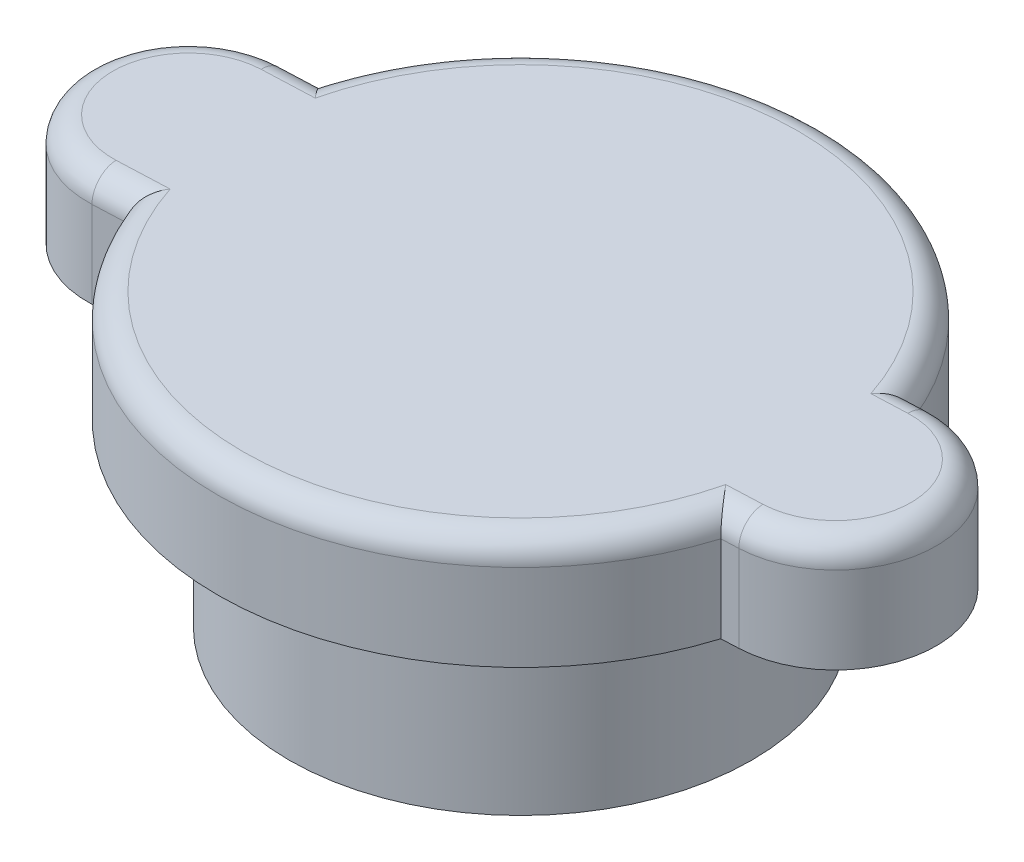
ISO-10303-21;
HEADER;
FILE_DESCRIPTION(('STEP AP214'),'2;1');
FILE_NAME('part.step','',(''),(''),'','','');
FILE_SCHEMA(('AUTOMOTIVE_DESIGN { 1 0 10303 214 1 1 1 1 }'));
ENDSEC;
DATA;
#1=APPLICATION_CONTEXT('core data for automotive mechanical design processes');
#2=APPLICATION_PROTOCOL_DEFINITION('international standard','automotive_design',2000,#1);
#3=PRODUCT_CONTEXT('',#1,'mechanical');
#4=PRODUCT('Part','Part','',(#3));
#5=PRODUCT_RELATED_PRODUCT_CATEGORY('part','',(#4));
#6=PRODUCT_DEFINITION_FORMATION('','',#4);
#7=PRODUCT_DEFINITION_CONTEXT('part definition',#1,'design');
#8=PRODUCT_DEFINITION('design','',#6,#7);
#9=PRODUCT_DEFINITION_SHAPE('','',#8);
#10=(LENGTH_UNIT() NAMED_UNIT(*) SI_UNIT(.MILLI.,.METRE.));
#11=(NAMED_UNIT(*) PLANE_ANGLE_UNIT() SI_UNIT($,.RADIAN.));
#12=(NAMED_UNIT(*) SI_UNIT($,.STERADIAN.) SOLID_ANGLE_UNIT());
#13=UNCERTAINTY_MEASURE_WITH_UNIT(LENGTH_MEASURE(1.E-05),#10,'distance_accuracy_value','');
#14=(GEOMETRIC_REPRESENTATION_CONTEXT(3) GLOBAL_UNCERTAINTY_ASSIGNED_CONTEXT((#13)) GLOBAL_UNIT_ASSIGNED_CONTEXT((#10,
#11,#12)) REPRESENTATION_CONTEXT('',''));
#15=CARTESIAN_POINT('',(0.,0.,0.));
#16=DIRECTION('',(0.,0.,1.));
#17=DIRECTION('',(1.,0.,0.));
#18=AXIS2_PLACEMENT_3D('',#15,#16,#17);
#19=CARTESIAN_POINT('',(0.,14.224,0.));
#20=DIRECTION('',(0.,-1.,0.));
#21=DIRECTION('',(0.,0.,-1.));
#22=AXIS2_PLACEMENT_3D('',#19,#20,#21);
#23=CYLINDRICAL_SURFACE('',#22,18.415);
#24=CARTESIAN_POINT('',(0.,14.224,0.));
#25=DIRECTION('',(0.,1.,0.));
#26=DIRECTION('',(0.,0.,1.));
#27=AXIS2_PLACEMENT_3D('',#24,#25,#26);
#28=CIRCLE('',#27,18.415);
#29=CARTESIAN_POINT('',(0.,14.224,18.415));
#30=VERTEX_POINT('',#29);
#31=EDGE_CURVE('E199',#30,#30,#28,.T.);
#32=ORIENTED_EDGE('',*,*,#31,.F.);
#33=EDGE_LOOP('',(#32));
#34=FACE_BOUND('',#33,.T.);
#35=CARTESIAN_POINT('',(0.,0.,0.));
#36=DIRECTION('',(0.,1.,0.));
#37=DIRECTION('',(0.,0.,1.));
#38=AXIS2_PLACEMENT_3D('',#35,#36,#37);
#39=CIRCLE('',#38,18.415);
#40=CARTESIAN_POINT('',(0.,0.,18.415));
#41=VERTEX_POINT('',#40);
#42=EDGE_CURVE('E157',#41,#41,#39,.T.);
#43=ORIENTED_EDGE('',*,*,#42,.T.);
#44=EDGE_LOOP('',(#43));
#45=FACE_BOUND('',#44,.T.);
#46=ADVANCED_FACE('F56',(#34,#45),#23,.T.);
#47=CARTESIAN_POINT('',(0.,0.,0.));
#48=DIRECTION('',(0.,1.,0.));
#49=DIRECTION('',(0.,0.,1.));
#50=AXIS2_PLACEMENT_3D('',#47,#48,#49);
#51=PLANE('',#50);
#52=ORIENTED_EDGE('',*,*,#42,.F.);
#53=EDGE_LOOP('',(#52));
#54=FACE_BOUND('',#53,.T.);
#55=ADVANCED_FACE('F347',(#54),#51,.F.);
#56=CARTESIAN_POINT('',(0.,23.114,0.));
#57=DIRECTION('',(0.,-1.,0.));
#58=DIRECTION('',(0.,0.,-1.));
#59=AXIS2_PLACEMENT_3D('',#56,#57,#58);
#60=CYLINDRICAL_SURFACE('',#59,24.0985030733377);
#61=DIRECTION('',(0.,-1.,0.));
#62=VECTOR('',#61,1.);
#63=CARTESIAN_POINT('',(-23.0324921981435,23.114,-7.08816996961317));
#64=LINE('',#63,#62);
#65=CARTESIAN_POINT('',(-23.0324921981435,14.224,-7.08816996961317));
#66=VERTEX_POINT('',#65);
#67=CARTESIAN_POINT('',(-23.0324921981435,21.114,-7.08816996961317));
#68=VERTEX_POINT('',#67);
#69=EDGE_CURVE('E179',#66,#68,#64,.F.);
#70=ORIENTED_EDGE('',*,*,#69,.T.);
#71=CARTESIAN_POINT('',(0.,21.114,0.));
#72=DIRECTION('',(0.,1.,0.));
#73=DIRECTION('',(0.,0.,1.));
#74=AXIS2_PLACEMENT_3D('',#71,#72,#73);
#75=CIRCLE('',#74,24.0985030733377);
#76=CARTESIAN_POINT('',(22.3744741533916,21.114,-8.95101987121461));
#77=VERTEX_POINT('',#76);
#78=EDGE_CURVE('E12',#68,#77,#75,.F.);
#79=ORIENTED_EDGE('',*,*,#78,.T.);
#80=DIRECTION('',(0.,-1.,0.));
#81=VECTOR('',#80,1.);
#82=CARTESIAN_POINT('',(22.3744741533916,23.114,-8.95101987121461));
#83=LINE('',#82,#81);
#84=CARTESIAN_POINT('',(22.3744741533916,14.224,-8.95101987121461));
#85=VERTEX_POINT('',#84);
#86=EDGE_CURVE('E196',#77,#85,#83,.T.);
#87=ORIENTED_EDGE('',*,*,#86,.T.);
#88=CARTESIAN_POINT('',(0.,14.224,0.));
#89=DIRECTION('',(0.,1.,0.));
#90=DIRECTION('',(0.,0.,1.));
#91=AXIS2_PLACEMENT_3D('',#88,#89,#90);
#92=CIRCLE('',#91,24.0985030733377);
#93=EDGE_CURVE('E175',#85,#66,#92,.T.);
#94=ORIENTED_EDGE('',*,*,#93,.T.);
#95=EDGE_LOOP('',(#70,#79,#87,#94));
#96=FACE_BOUND('',#95,.T.);
#97=ADVANCED_FACE('F324',(#96),#60,.T.);
#98=CARTESIAN_POINT('',(0.,14.224,0.));
#99=DIRECTION('',(0.,1.,0.));
#100=DIRECTION('',(0.,0.,1.));
#101=AXIS2_PLACEMENT_3D('',#98,#99,#100);
#102=PLANE('',#101);
#103=ORIENTED_EDGE('',*,*,#31,.T.);
#104=EDGE_LOOP('',(#103));
#105=FACE_BOUND('',#104,.T.);
#106=ORIENTED_EDGE('',*,*,#93,.F.);
#107=DIRECTION('',(0.999159509215093,0.,-0.0409911593524141));
#108=VECTOR('',#107,1.);
#109=CARTESIAN_POINT('',(-25.7076605564393,14.224,-6.97841947286257));
#110=LINE('',#109,#108);
#111=CARTESIAN_POINT('',(23.7492394811986,14.224,-9.00742050004771));
#112=VERTEX_POINT('',#111);
#113=EDGE_CURVE('E186',#85,#112,#110,.T.);
#114=ORIENTED_EDGE('',*,*,#113,.T.);
#115=CARTESIAN_POINT('',(24.0782485035745,14.224,-0.987825579633825));
#116=DIRECTION('',(0.,1.,0.));
#117=DIRECTION('',(0.,0.,1.));
#118=AXIS2_PLACEMENT_3D('',#115,#116,#117);
#119=CIRCLE('',#118,8.02634098604919);
#120=CARTESIAN_POINT('',(24.4072575259505,14.224,7.03176934078006));
#121=VERTEX_POINT('',#120);
#122=EDGE_CURVE('E168',#121,#112,#119,.T.);
#123=ORIENTED_EDGE('',*,*,#122,.F.);
#124=DIRECTION('',(0.999159509215093,0.,-0.0409911593524139));
#125=VECTOR('',#124,1.);
#126=CARTESIAN_POINT('',(-25.0496425116874,14.224,9.0607703679652));
#127=LINE('',#126,#125);
#128=CARTESIAN_POINT('',(23.0324921981435,14.224,7.08816996961317));
#129=VERTEX_POINT('',#128);
#130=EDGE_CURVE('E150',#129,#121,#127,.T.);
#131=ORIENTED_EDGE('',*,*,#130,.F.);
#132=CARTESIAN_POINT('',(-22.3744741533916,14.224,8.95101987121461));
#133=VERTEX_POINT('',#132);
#134=EDGE_CURVE('E165',#133,#129,#92,.T.);
#135=ORIENTED_EDGE('',*,*,#134,.F.);
#136=CARTESIAN_POINT('',(-25.0496425116874,14.224,9.0607703679652));
#137=VERTEX_POINT('',#136);
#138=EDGE_CURVE('E169',#137,#133,#127,.T.);
#139=ORIENTED_EDGE('',*,*,#138,.F.);
#140=CARTESIAN_POINT('',(-25.3786515340634,14.224,1.04117544755132));
#141=DIRECTION('',(0.,1.,0.));
#142=DIRECTION('',(0.,0.,1.));
#143=AXIS2_PLACEMENT_3D('',#140,#141,#142);
#144=CIRCLE('',#143,8.02634098604918);
#145=CARTESIAN_POINT('',(-25.7076605564393,14.224,-6.97841947286257));
#146=VERTEX_POINT('',#145);
#147=EDGE_CURVE('E170',#146,#137,#144,.T.);
#148=ORIENTED_EDGE('',*,*,#147,.F.);
#149=EDGE_CURVE('E187',#146,#66,#110,.T.);
#150=ORIENTED_EDGE('',*,*,#149,.T.);
#151=EDGE_LOOP('',(#106,#114,#123,#131,#135,#139,#148,#150));
#152=FACE_BOUND('',#151,.T.);
#153=ADVANCED_FACE('F163',(#105,#152),#102,.F.);
#154=CARTESIAN_POINT('',(0.,23.114,0.));
#155=DIRECTION('',(0.,1.,0.));
#156=DIRECTION('',(0.,0.,1.));
#157=AXIS2_PLACEMENT_3D('',#154,#155,#156);
#158=PLANE('',#157);
#159=CARTESIAN_POINT('',(24.0782485035745,23.114,-0.987825579633825));
#160=DIRECTION('',(0.,1.,0.));
#161=DIRECTION('',(0.,0.,1.));
#162=AXIS2_PLACEMENT_3D('',#159,#160,#161);
#163=CIRCLE('',#162,6.02634098604919);
#164=CARTESIAN_POINT('',(24.3252752072456,23.114,5.03345032234988));
#165=VERTEX_POINT('',#164);
#166=CARTESIAN_POINT('',(23.8312217999034,23.114,-7.00910148161753));
#167=VERTEX_POINT('',#166);
#168=EDGE_CURVE('E219',#165,#167,#163,.T.);
#169=ORIENTED_EDGE('',*,*,#168,.T.);
#170=DIRECTION('',(0.999159509215093,0.,-0.0409911593524141));
#171=VECTOR('',#170,1.);
#172=CARTESIAN_POINT('',(-0.247026703671126,23.114,-6.0212759019837));
#173=LINE('',#172,#171);
#174=CARTESIAN_POINT('',(20.9960315173369,23.114,-6.89278598284556));
#175=VERTEX_POINT('',#174);
#176=EDGE_CURVE('E221',#167,#175,#173,.F.);
#177=ORIENTED_EDGE('',*,*,#176,.T.);
#178=CARTESIAN_POINT('',(0.,23.114,0.));
#179=DIRECTION('',(0.,1.,0.));
#180=DIRECTION('',(0.,0.,1.));
#181=AXIS2_PLACEMENT_3D('',#178,#179,#180);
#182=CIRCLE('',#181,22.0985030733377);
#183=CARTESIAN_POINT('',(-21.4900849246791,23.114,-5.14976582112183));
#184=VERTEX_POINT('',#183);
#185=EDGE_CURVE('E207',#175,#184,#182,.T.);
#186=ORIENTED_EDGE('',*,*,#185,.T.);
#187=DIRECTION('',(0.999159509215093,0.,-0.0409911593524141));
#188=VECTOR('',#187,1.);
#189=CARTESIAN_POINT('',(-0.247026703671126,23.114,-6.0212759019837));
#190=LINE('',#189,#188);
#191=CARTESIAN_POINT('',(-25.6256782377345,23.114,-4.98010045443238));
#192=VERTEX_POINT('',#191);
#193=EDGE_CURVE('E209',#184,#192,#190,.F.);
#194=ORIENTED_EDGE('',*,*,#193,.T.);
#195=CARTESIAN_POINT('',(-25.3786515340634,23.114,1.04117544755132));
#196=DIRECTION('',(0.,1.,0.));
#197=DIRECTION('',(0.,0.,1.));
#198=AXIS2_PLACEMENT_3D('',#195,#196,#197);
#199=CIRCLE('',#198,6.02634098604918);
#200=CARTESIAN_POINT('',(-25.1316248303922,23.114,7.06245134953502));
#201=VERTEX_POINT('',#200);
#202=EDGE_CURVE('E211',#192,#201,#199,.T.);
#203=ORIENTED_EDGE('',*,*,#202,.T.);
#204=DIRECTION('',(0.999159509215093,0.,-0.0409911593524139));
#205=VECTOR('',#204,1.);
#206=CARTESIAN_POINT('',(-22.4564564720964,23.114,6.95270085278442));
#207=LINE('',#206,#205);
#208=CARTESIAN_POINT('',(-20.9960315173369,23.114,6.89278598284557));
#209=VERTEX_POINT('',#208);
#210=EDGE_CURVE('E213',#201,#209,#207,.T.);
#211=ORIENTED_EDGE('',*,*,#210,.T.);
#212=CARTESIAN_POINT('',(0.,23.114,0.));
#213=DIRECTION('',(0.,1.,0.));
#214=DIRECTION('',(0.,0.,1.));
#215=AXIS2_PLACEMENT_3D('',#212,#213,#214);
#216=CIRCLE('',#215,22.0985030733377);
#217=CARTESIAN_POINT('',(21.4900849246791,23.114,5.14976582112183));
#218=VERTEX_POINT('',#217);
#219=EDGE_CURVE('E215',#209,#218,#216,.T.);
#220=ORIENTED_EDGE('',*,*,#219,.T.);
#221=DIRECTION('',(0.999159509215093,0.,-0.0409911593524139));
#222=VECTOR('',#221,1.);
#223=CARTESIAN_POINT('',(24.3252752072456,23.114,5.03345032234988));
#224=LINE('',#223,#222);
#225=EDGE_CURVE('E217',#218,#165,#224,.T.);
#226=ORIENTED_EDGE('',*,*,#225,.T.);
#227=EDGE_LOOP('',(#169,#177,#186,#194,#203,#211,#220,#226));
#228=FACE_BOUND('',#227,.T.);
#229=ADVANCED_FACE('F305',(#228),#158,.T.);
#230=DIRECTION('',(0.,-1.,0.));
#231=VECTOR('',#230,1.);
#232=CARTESIAN_POINT('',(23.0324921981435,23.114,7.08816996961317));
#233=LINE('',#232,#231);
#234=CARTESIAN_POINT('',(23.0324921981435,21.114,7.08816996961317));
#235=VERTEX_POINT('',#234);
#236=EDGE_CURVE('E146',#235,#129,#233,.T.);
#237=ORIENTED_EDGE('',*,*,#236,.F.);
#238=CARTESIAN_POINT('',(0.,21.114,0.));
#239=DIRECTION('',(0.,1.,0.));
#240=DIRECTION('',(0.,0.,1.));
#241=AXIS2_PLACEMENT_3D('',#238,#239,#240);
#242=CIRCLE('',#241,24.0985030733377);
#243=CARTESIAN_POINT('',(-22.3744741533916,21.114,8.9510198712146));
#244=VERTEX_POINT('',#243);
#245=EDGE_CURVE('E227',#235,#244,#242,.F.);
#246=ORIENTED_EDGE('',*,*,#245,.T.);
#247=DIRECTION('',(0.,-1.,0.));
#248=VECTOR('',#247,1.);
#249=CARTESIAN_POINT('',(-22.3744741533916,23.114,8.9510198712146));
#250=LINE('',#249,#248);
#251=EDGE_CURVE('E158',#133,#244,#250,.F.);
#252=ORIENTED_EDGE('',*,*,#251,.F.);
#253=ORIENTED_EDGE('',*,*,#134,.T.);
#254=EDGE_LOOP('',(#237,#246,#252,#253));
#255=FACE_BOUND('',#254,.T.);
#256=ADVANCED_FACE('F172',(#255),#60,.T.);
#257=CARTESIAN_POINT('',(-25.3786515340634,23.114,1.04117544755132));
#258=DIRECTION('',(0.,-1.,0.));
#259=DIRECTION('',(0.,0.,-1.));
#260=AXIS2_PLACEMENT_3D('',#257,#258,#259);
#261=CYLINDRICAL_SURFACE('',#260,8.02634098604918);
#262=DIRECTION('',(0.,-1.,0.));
#263=VECTOR('',#262,1.);
#264=CARTESIAN_POINT('',(-25.0496425116874,23.114,9.0607703679652));
#265=LINE('',#264,#263);
#266=CARTESIAN_POINT('',(-25.0496425116874,21.114,9.0607703679652));
#267=VERTEX_POINT('',#266);
#268=EDGE_CURVE('E176',#267,#137,#265,.T.);
#269=ORIENTED_EDGE('',*,*,#268,.F.);
#270=CARTESIAN_POINT('',(-25.3786515340634,21.114,1.04117544755132));
#271=DIRECTION('',(0.,1.,0.));
#272=DIRECTION('',(0.,0.,1.));
#273=AXIS2_PLACEMENT_3D('',#270,#271,#272);
#274=CIRCLE('',#273,8.02634098604918);
#275=CARTESIAN_POINT('',(-25.7076605564393,21.114,-6.97841947286257));
#276=VERTEX_POINT('',#275);
#277=EDGE_CURVE('E80',#267,#276,#274,.F.);
#278=ORIENTED_EDGE('',*,*,#277,.T.);
#279=DIRECTION('',(0.,-1.,0.));
#280=VECTOR('',#279,1.);
#281=CARTESIAN_POINT('',(-25.7076605564393,23.114,-6.97841947286257));
#282=LINE('',#281,#280);
#283=EDGE_CURVE('E190',#276,#146,#282,.T.);
#284=ORIENTED_EDGE('',*,*,#283,.T.);
#285=ORIENTED_EDGE('',*,*,#147,.T.);
#286=EDGE_LOOP('',(#269,#278,#284,#285));
#287=FACE_BOUND('',#286,.T.);
#288=ADVANCED_FACE('F332',(#287),#261,.T.);
#289=CARTESIAN_POINT('',(-25.0496425116874,23.114,9.0607703679652));
#290=DIRECTION('',(-0.0409911593524139,0.,-0.999159509215093));
#291=DIRECTION('',(-0.999159509215093,0.,0.0409911593524139));
#292=AXIS2_PLACEMENT_3D('',#289,#290,#291);
#293=PLANE('',#292);
#294=ORIENTED_EDGE('',*,*,#251,.T.);
#295=DIRECTION('',(0.999159509215093,0.,-0.0409911593524139));
#296=VECTOR('',#295,1.);
#297=CARTESIAN_POINT('',(-25.0496425116874,21.114,9.0607703679652));
#298=LINE('',#297,#296);
#299=EDGE_CURVE('E229',#244,#267,#298,.F.);
#300=ORIENTED_EDGE('',*,*,#299,.T.);
#301=ORIENTED_EDGE('',*,*,#268,.T.);
#302=ORIENTED_EDGE('',*,*,#138,.T.);
#303=EDGE_LOOP('',(#294,#300,#301,#302));
#304=FACE_BOUND('',#303,.T.);
#305=ADVANCED_FACE('F334',(#304),#293,.F.);
#306=CARTESIAN_POINT('',(-25.7076605564393,23.114,-6.97841947286257));
#307=DIRECTION('',(-0.0409911593524141,0.,-0.999159509215093));
#308=DIRECTION('',(-0.999159509215093,0.,0.0409911593524141));
#309=AXIS2_PLACEMENT_3D('',#306,#307,#308);
#310=PLANE('',#309);
#311=ORIENTED_EDGE('',*,*,#283,.F.);
#312=DIRECTION('',(0.999159509215093,0.,-0.0409911593524141));
#313=VECTOR('',#312,1.);
#314=CARTESIAN_POINT('',(-25.7076605564393,21.114,-6.97841947286257));
#315=LINE('',#314,#313);
#316=EDGE_CURVE('E65',#276,#68,#315,.T.);
#317=ORIENTED_EDGE('',*,*,#316,.T.);
#318=ORIENTED_EDGE('',*,*,#69,.F.);
#319=ORIENTED_EDGE('',*,*,#149,.F.);
#320=EDGE_LOOP('',(#311,#317,#318,#319));
#321=FACE_BOUND('',#320,.T.);
#322=ADVANCED_FACE('F331',(#321),#310,.T.);
#323=CARTESIAN_POINT('',(24.0782485035745,23.114,-0.987825579633825));
#324=DIRECTION('',(0.,-1.,0.));
#325=DIRECTION('',(0.,0.,-1.));
#326=AXIS2_PLACEMENT_3D('',#323,#324,#325);
#327=CYLINDRICAL_SURFACE('',#326,8.02634098604919);
#328=DIRECTION('',(0.,-1.,0.));
#329=VECTOR('',#328,1.);
#330=CARTESIAN_POINT('',(23.7492394811986,23.114,-9.00742050004771));
#331=LINE('',#330,#329);
#332=CARTESIAN_POINT('',(23.7492394811986,21.114,-9.00742050004771));
#333=VERTEX_POINT('',#332);
#334=EDGE_CURVE('E192',#333,#112,#331,.T.);
#335=ORIENTED_EDGE('',*,*,#334,.F.);
#336=CARTESIAN_POINT('',(24.0782485035745,21.114,-0.987825579633825));
#337=DIRECTION('',(0.,1.,0.));
#338=DIRECTION('',(0.,0.,1.));
#339=AXIS2_PLACEMENT_3D('',#336,#337,#338);
#340=CIRCLE('',#339,8.02634098604919);
#341=CARTESIAN_POINT('',(24.4072575259505,21.114,7.03176934078006));
#342=VERTEX_POINT('',#341);
#343=EDGE_CURVE('E224',#333,#342,#340,.F.);
#344=ORIENTED_EDGE('',*,*,#343,.T.);
#345=DIRECTION('',(0.,-1.,0.));
#346=VECTOR('',#345,1.);
#347=CARTESIAN_POINT('',(24.4072575259505,23.114,7.03176934078006));
#348=LINE('',#347,#346);
#349=EDGE_CURVE('E180',#342,#121,#348,.T.);
#350=ORIENTED_EDGE('',*,*,#349,.T.);
#351=ORIENTED_EDGE('',*,*,#122,.T.);
#352=EDGE_LOOP('',(#335,#344,#350,#351));
#353=FACE_BOUND('',#352,.T.);
#354=ADVANCED_FACE('F341',(#353),#327,.T.);
#355=ORIENTED_EDGE('',*,*,#86,.F.);
#356=DIRECTION('',(0.999159509215093,0.,-0.0409911593524141));
#357=VECTOR('',#356,1.);
#358=CARTESIAN_POINT('',(-25.7076605564393,21.114,-6.97841947286257));
#359=LINE('',#358,#357);
#360=EDGE_CURVE('E202',#77,#333,#359,.T.);
#361=ORIENTED_EDGE('',*,*,#360,.T.);
#362=ORIENTED_EDGE('',*,*,#334,.T.);
#363=ORIENTED_EDGE('',*,*,#113,.F.);
#364=EDGE_LOOP('',(#355,#361,#362,#363));
#365=FACE_BOUND('',#364,.T.);
#366=ADVANCED_FACE('F327',(#365),#310,.T.);
#367=ORIENTED_EDGE('',*,*,#349,.F.);
#368=DIRECTION('',(0.999159509215093,0.,-0.0409911593524139));
#369=VECTOR('',#368,1.);
#370=CARTESIAN_POINT('',(23.0324921981435,21.114,7.08816996961317));
#371=LINE('',#370,#369);
#372=EDGE_CURVE('E153',#342,#235,#371,.F.);
#373=ORIENTED_EDGE('',*,*,#372,.T.);
#374=ORIENTED_EDGE('',*,*,#236,.T.);
#375=ORIENTED_EDGE('',*,*,#130,.T.);
#376=EDGE_LOOP('',(#367,#373,#374,#375));
#377=FACE_BOUND('',#376,.T.);
#378=ADVANCED_FACE('F149',(#377),#293,.F.);
#379=CARTESIAN_POINT('',(0.247026703671125,21.114,6.0212759019837));
#380=DIRECTION('',(-0.999159509215093,0.,0.0409911593524139));
#381=DIRECTION('',(0.0409911593524139,0.,0.999159509215093));
#382=AXIS2_PLACEMENT_3D('',#379,#380,#381);
#383=CYLINDRICAL_SURFACE('',#382,2.);
#384=CARTESIAN_POINT('',(-22.3744741533916,21.114,8.9510198712146));
#385=CARTESIAN_POINT('',(-22.3744800494696,21.1628408454334,8.95102963175667));
#386=CARTESIAN_POINT('',(-22.3732832793538,21.2116759167955,8.94918071582054));
#387=CARTESIAN_POINT('',(-22.3685296946854,21.3089352940315,8.94184025911029));
#388=CARTESIAN_POINT('',(-22.3649739031695,21.3573597687532,8.93635029734858));
#389=CARTESIAN_POINT('',(-22.3555725108031,21.453186707887,8.92184097065932));
#390=CARTESIAN_POINT('',(-22.3497391651781,21.500593232937,8.91284049561353));
#391=CARTESIAN_POINT('',(-22.3358699294122,21.594296474588,8.89145380908013));
#392=CARTESIAN_POINT('',(-22.3278338994087,21.6405931205127,8.87906738259684));
#393=CARTESIAN_POINT('',(-22.3005954481301,21.7772160488451,8.83711374759362));
#394=CARTESIAN_POINT('',(-22.2782406003702,21.8654944392747,8.80271803409889));
#395=CARTESIAN_POINT('',(-22.2261679454461,22.0344980658561,8.72277281807686));
#396=CARTESIAN_POINT('',(-22.1964418051814,22.1152146102174,8.67721069282634));
#397=CARTESIAN_POINT('',(-22.1286701019366,22.272726914948,8.5736106317911));
#398=CARTESIAN_POINT('',(-22.0902140137348,22.3489416337043,8.51496110142272));
#399=CARTESIAN_POINT('',(-22.0075941508942,22.4906087032483,8.38936836131895));
#400=CARTESIAN_POINT('',(-21.9634289156002,22.5560582900622,8.32242302932844));
#401=CARTESIAN_POINT('',(-21.8624846164585,22.6863504787235,8.16996577244482));
#402=CARTESIAN_POINT('',(-21.8048469195891,22.7491142133867,8.08324842500092));
#403=CARTESIAN_POINT('',(-21.6848887855517,22.8595334133368,7.90360658515537));
#404=CARTESIAN_POINT('',(-21.6225633181905,22.9071723544872,7.81067543727673));
#405=CARTESIAN_POINT('',(-21.4822555419873,22.9953359842754,7.60249916699999));
#406=CARTESIAN_POINT('',(-21.4035691282731,23.0327249766788,7.48640275102905));
#407=CARTESIAN_POINT('',(-21.2434375408175,23.086903903736,7.25160021539578));
#408=CARTESIAN_POINT('',(-21.1619963468125,23.1037223508608,7.13289794066713));
#409=CARTESIAN_POINT('',(-21.0538026300723,23.1127013114173,6.97619711423227));
#410=CARTESIAN_POINT('',(-21.0275339674882,23.1138528062817,6.93822775785211));
#411=CARTESIAN_POINT('',(-20.9994954396395,23.1139955888305,6.89778175064003));
#412=CARTESIAN_POINT('',(-20.9977635587264,23.1139999981211,6.89528381690682));
#413=CARTESIAN_POINT('',(-20.9960315173369,23.114,6.89278598284556));
#414=B_SPLINE_CURVE_WITH_KNOTS('',3,(#384,#385,#386,#387,#388,#389,#390,#391,#392,#393,#394,
#395,#396,#397,#398,#399,#400,#401,#402,#403,#404,#405,#406,#407,#408,#409,#410,#411,#412,#413),
.UNSPECIFIED.,.F.,.F.,(4,2,2,2,2,2,2,2,2,2,2,2,2,2,4),(0.,0.146463334685826,0.292863194111355,
0.438485916937579,0.584117888428689,0.874721894272272,1.16565593197721,1.47519946759629,
1.78482235562181,2.14820961694034,2.51199253066936,2.9458162608141,3.37903799157044,
3.51756275870741,3.52668151843988),.UNSPECIFIED.);
#415=EDGE_CURVE('E287',#209,#244,#414,.F.);
#416=ORIENTED_EDGE('',*,*,#415,.F.);
#417=ORIENTED_EDGE('',*,*,#210,.F.);
#418=CARTESIAN_POINT('',(-25.1316248303922,21.114,7.06245134953502));
#419=DIRECTION('',(-0.999159509215093,0.,0.0409911593524139));
#420=DIRECTION('',(0.0409911593524139,0.,0.999159509215093));
#421=AXIS2_PLACEMENT_3D('',#418,#419,#420);
#422=CIRCLE('',#421,2.);
#423=EDGE_CURVE('E60',#267,#201,#422,.T.);
#424=ORIENTED_EDGE('',*,*,#423,.F.);
#425=ORIENTED_EDGE('',*,*,#299,.F.);
#426=EDGE_LOOP('',(#416,#417,#424,#425));
#427=FACE_BOUND('',#426,.T.);
#428=ADVANCED_FACE('F284',(#427),#383,.T.);
#429=CARTESIAN_POINT('',(-25.3786515340634,21.114,1.04117544755132));
#430=DIRECTION('',(0.,1.,0.));
#431=DIRECTION('',(0.,0.,1.));
#432=AXIS2_PLACEMENT_3D('',#429,#430,#431);
#433=TOROIDAL_SURFACE('',#432,6.02634098604918,2.);
#434=ORIENTED_EDGE('',*,*,#423,.T.);
#435=ORIENTED_EDGE('',*,*,#202,.F.);
#436=CARTESIAN_POINT('',(-25.6256782377345,21.114,-4.98010045443238));
#437=DIRECTION('',(0.999159509215093,0.,-0.0409911593524139));
#438=DIRECTION('',(-0.0409911593524139,0.,-0.999159509215093));
#439=AXIS2_PLACEMENT_3D('',#436,#437,#438);
#440=CIRCLE('',#439,2.);
#441=EDGE_CURVE('E280',#276,#192,#440,.T.);
#442=ORIENTED_EDGE('',*,*,#441,.F.);
#443=ORIENTED_EDGE('',*,*,#277,.F.);
#444=EDGE_LOOP('',(#434,#435,#442,#443));
#445=FACE_BOUND('',#444,.T.);
#446=ADVANCED_FACE('F58',(#445),#433,.T.);
#447=CARTESIAN_POINT('',(0.,21.114,0.));
#448=DIRECTION('',(0.,1.,0.));
#449=DIRECTION('',(0.,0.,1.));
#450=AXIS2_PLACEMENT_3D('',#447,#448,#449);
#451=TOROIDAL_SURFACE('',#450,22.0985030733377,2.);
#452=ORIENTED_EDGE('',*,*,#415,.T.);
#453=ORIENTED_EDGE('',*,*,#245,.F.);
#454=CARTESIAN_POINT('',(23.0324921981435,21.114,7.08816996961317));
#455=CARTESIAN_POINT('',(23.0324988739268,21.1628408454334,7.08817921438657));
#456=CARTESIAN_POINT('',(23.0311546746018,21.2116759167955,7.08643454335057));
#457=CARTESIAN_POINT('',(23.0258157827293,21.3089352940315,7.07950813695995));
#458=CARTESIAN_POINT('',(23.0218222391227,21.3573597687532,7.07432789151096));
#459=CARTESIAN_POINT('',(23.011263932134,21.453186707887,7.06063742428242));
#460=CARTESIAN_POINT('',(23.0047129301279,21.500593232937,7.05214502503688));
#461=CARTESIAN_POINT('',(22.9891384461327,21.594296474588,7.03196628598085));
#462=CARTESIAN_POINT('',(22.9801148071401,21.6405931205127,7.02027974335382));
#463=CARTESIAN_POINT('',(22.9495313266024,21.7772160488451,6.9806982901687));
#464=CARTESIAN_POINT('',(22.9244341331367,21.8654944392747,6.94824932708323));
#465=CARTESIAN_POINT('',(22.8659878854651,22.0344980658561,6.87283821988563));
#466=CARTESIAN_POINT('',(22.8326294921922,22.1152146102174,6.8298641780623));
#467=CARTESIAN_POINT('',(22.7565993045447,22.272726914948,6.73216368178161));
#468=CARTESIAN_POINT('',(22.7134682667391,22.3489416337044,6.67686131555712));
#469=CARTESIAN_POINT('',(22.6208383220722,22.4906087032483,6.55845831114597));
#470=CARTESIAN_POINT('',(22.5713377856232,22.5560582900622,6.49535567748338));
#471=CARTESIAN_POINT('',(22.4582444205784,22.6863504787235,6.35167945297665));
#472=CARTESIAN_POINT('',(22.3936971041646,22.7491142133867,6.26997482402641));
#473=CARTESIAN_POINT('',(22.2594270191923,22.8595334133368,6.10076285983254));
#474=CARTESIAN_POINT('',(22.1896986921718,22.9071723544872,6.01324930351828));
#475=CARTESIAN_POINT('',(22.0328099984358,22.9953359842754,5.81726570893136));
#476=CARTESIAN_POINT('',(21.9448781606654,23.0327249766788,5.70800491353415));
#477=CARTESIAN_POINT('',(21.7660512263122,23.086903903736,5.48710836853918));
#478=CARTESIAN_POINT('',(21.6751604110434,23.1037223508608,5.3754761249602));
#479=CARTESIAN_POINT('',(21.5544943851657,23.1127013114173,5.22816441617124));
#480=CARTESIAN_POINT('',(21.5252038001606,23.1138528062817,5.19247441353833));
#481=CARTESIAN_POINT('',(21.4939464266888,23.1139955888305,5.1544610586881));
#482=CARTESIAN_POINT('',(21.4920157515704,23.1139999981211,5.15211338366389));
#483=CARTESIAN_POINT('',(21.4900849246791,23.114,5.14976582112183));
#484=B_SPLINE_CURVE_WITH_KNOTS('',3,(#454,#455,#456,#457,#458,#459,#460,#461,#462,#463,#464,
#465,#466,#467,#468,#469,#470,#471,#472,#473,#474,#475,#476,#477,#478,#479,#480,#481,#482,#483),
.UNSPECIFIED.,.F.,.F.,(4,2,2,2,2,2,2,2,2,2,2,2,2,2,4),(0.,0.146463334685826,0.292863194111355,
0.438485916937578,0.584117888428689,0.874721894272272,1.16565593197721,1.47519946759629,
1.78482235562181,2.14820961694034,2.51199253066936,2.9458162608141,3.37903799157045,
3.51756275870741,3.52668151843988),.UNSPECIFIED.);
#485=EDGE_CURVE('E273',#218,#235,#484,.F.);
#486=ORIENTED_EDGE('',*,*,#485,.F.);
#487=ORIENTED_EDGE('',*,*,#219,.F.);
#488=EDGE_LOOP('',(#452,#453,#486,#487));
#489=FACE_BOUND('',#488,.T.);
#490=ADVANCED_FACE('F262',(#489),#451,.T.);
#491=CARTESIAN_POINT('',(-25.6256782377345,21.114,-4.98010045443238));
#492=DIRECTION('',(0.999159509215093,0.,-0.0409911593524141));
#493=DIRECTION('',(-0.0409911593524141,0.,-0.999159509215093));
#494=AXIS2_PLACEMENT_3D('',#491,#492,#493);
#495=CYLINDRICAL_SURFACE('',#494,2.);
#496=ORIENTED_EDGE('',*,*,#441,.T.);
#497=ORIENTED_EDGE('',*,*,#193,.F.);
#498=CARTESIAN_POINT('',(-23.0324921981435,21.114,-7.08816996961317));
#499=CARTESIAN_POINT('',(-23.0324988739268,21.1628408454334,-7.08817921438656));
#500=CARTESIAN_POINT('',(-23.0311546746018,21.2116759167955,-7.08643454335056));
#501=CARTESIAN_POINT('',(-23.0258157827293,21.3089352940315,-7.07950813695995));
#502=CARTESIAN_POINT('',(-23.0218222391227,21.3573597687532,-7.07432789151096));
#503=CARTESIAN_POINT('',(-23.011263932134,21.453186707887,-7.06063742428241));
#504=CARTESIAN_POINT('',(-23.0047129301279,21.500593232937,-7.05214502503687));
#505=CARTESIAN_POINT('',(-22.9891384461327,21.594296474588,-7.03196628598085));
#506=CARTESIAN_POINT('',(-22.9801148071401,21.6405931205127,-7.02027974335382));
#507=CARTESIAN_POINT('',(-22.9495313266024,21.7772160488451,-6.9806982901687));
#508=CARTESIAN_POINT('',(-22.9244341331367,21.8654944392747,-6.94824932708323));
#509=CARTESIAN_POINT('',(-22.8659878854651,22.0344980658561,-6.87283821988563));
#510=CARTESIAN_POINT('',(-22.8326294921922,22.1152146102174,-6.82986417806229));
#511=CARTESIAN_POINT('',(-22.7565993045447,22.272726914948,-6.73216368178161));
#512=CARTESIAN_POINT('',(-22.7134682667391,22.3489416337043,-6.67686131555712));
#513=CARTESIAN_POINT('',(-22.6208383220722,22.4906087032483,-6.55845831114597));
#514=CARTESIAN_POINT('',(-22.5713377856232,22.5560582900622,-6.49535567748338));
#515=CARTESIAN_POINT('',(-22.4582444205784,22.6863504787235,-6.35167945297665));
#516=CARTESIAN_POINT('',(-22.3936971041646,22.7491142133867,-6.26997482402641));
#517=CARTESIAN_POINT('',(-22.2594270191923,22.8595334133368,-6.10076285983254));
#518=CARTESIAN_POINT('',(-22.1896986921718,22.9071723544872,-6.01324930351828));
#519=CARTESIAN_POINT('',(-22.0328099984358,22.9953359842754,-5.81726570893136));
#520=CARTESIAN_POINT('',(-21.9448781606654,23.0327249766788,-5.70800491353415));
#521=CARTESIAN_POINT('',(-21.7660512263122,23.086903903736,-5.48710836853916));
#522=CARTESIAN_POINT('',(-21.6751604110434,23.1037223508608,-5.37547612496016));
#523=CARTESIAN_POINT('',(-21.5544943851657,23.1127013114173,-5.22816441617125));
#524=CARTESIAN_POINT('',(-21.5252038001606,23.1138528062817,-5.19247441353836));
#525=CARTESIAN_POINT('',(-21.4939464266889,23.1139955888305,-5.1544610586881));
#526=CARTESIAN_POINT('',(-21.4920157515704,23.1139999981211,-5.15211338366389));
#527=CARTESIAN_POINT('',(-21.4900849246791,23.114,-5.14976582112183));
#528=B_SPLINE_CURVE_WITH_KNOTS('',3,(#498,#499,#500,#501,#502,#503,#504,#505,#506,#507,#508,
#509,#510,#511,#512,#513,#514,#515,#516,#517,#518,#519,#520,#521,#522,#523,#524,#525,#526,#527),
.UNSPECIFIED.,.F.,.F.,(4,2,2,2,2,2,2,2,2,2,2,2,2,2,4),(0.,0.146463334685826,0.292863194111355,
0.438485916937575,0.584117888428688,0.874721894272272,1.16565593197721,1.47519946759629,
1.78482235562181,2.14820961694034,2.51199253066936,2.9458162608141,3.37903799157045,
3.5175627587074,3.52668151843987),.UNSPECIFIED.);
#529=EDGE_CURVE('E266',#68,#184,#528,.T.);
#530=ORIENTED_EDGE('',*,*,#529,.F.);
#531=ORIENTED_EDGE('',*,*,#316,.F.);
#532=EDGE_LOOP('',(#496,#497,#530,#531));
#533=FACE_BOUND('',#532,.T.);
#534=ADVANCED_FACE('F257',(#533),#495,.T.);
#535=CARTESIAN_POINT('',(0.247026703671125,21.114,6.0212759019837));
#536=DIRECTION('',(-0.999159509215093,0.,0.0409911593524139));
#537=DIRECTION('',(0.0409911593524139,0.,0.999159509215093));
#538=AXIS2_PLACEMENT_3D('',#535,#536,#537);
#539=CYLINDRICAL_SURFACE('',#538,2.);
#540=ORIENTED_EDGE('',*,*,#485,.T.);
#541=ORIENTED_EDGE('',*,*,#372,.F.);
#542=CARTESIAN_POINT('',(24.3252752072456,21.114,5.03345032234988));
#543=DIRECTION('',(0.999159509215093,0.,-0.0409911593524139));
#544=DIRECTION('',(-0.0409911593524139,0.,-0.999159509215093));
#545=AXIS2_PLACEMENT_3D('',#542,#543,#544);
#546=CIRCLE('',#545,2.);
#547=EDGE_CURVE('E243',#165,#342,#546,.T.);
#548=ORIENTED_EDGE('',*,*,#547,.F.);
#549=ORIENTED_EDGE('',*,*,#225,.F.);
#550=EDGE_LOOP('',(#540,#541,#548,#549));
#551=FACE_BOUND('',#550,.T.);
#552=ADVANCED_FACE('F261',(#551),#539,.T.);
#553=CARTESIAN_POINT('',(0.,21.114,0.));
#554=DIRECTION('',(0.,1.,0.));
#555=DIRECTION('',(0.,0.,1.));
#556=AXIS2_PLACEMENT_3D('',#553,#554,#555);
#557=TOROIDAL_SURFACE('',#556,22.0985030733377,2.);
#558=ORIENTED_EDGE('',*,*,#529,.T.);
#559=ORIENTED_EDGE('',*,*,#185,.F.);
#560=CARTESIAN_POINT('',(22.3744741533916,21.114,-8.95101987121461));
#561=CARTESIAN_POINT('',(22.3744800494696,21.1628408454334,-8.95102963175667));
#562=CARTESIAN_POINT('',(22.3732832793538,21.2116759167955,-8.94918071582054));
#563=CARTESIAN_POINT('',(22.3685296946854,21.3089352940315,-8.9418402591103));
#564=CARTESIAN_POINT('',(22.3649739031695,21.3573597687532,-8.93635029734859));
#565=CARTESIAN_POINT('',(22.3555725108031,21.453186707887,-8.92184097065932));
#566=CARTESIAN_POINT('',(22.3497391651781,21.500593232937,-8.91284049561353));
#567=CARTESIAN_POINT('',(22.3358699294122,21.594296474588,-8.89145380908013));
#568=CARTESIAN_POINT('',(22.3278338994087,21.6405931205127,-8.87906738259685));
#569=CARTESIAN_POINT('',(22.3005954481301,21.7772160488451,-8.83711374759362));
#570=CARTESIAN_POINT('',(22.2782406003702,21.8654944392747,-8.8027180340989));
#571=CARTESIAN_POINT('',(22.2261679454461,22.0344980658561,-8.72277281807686));
#572=CARTESIAN_POINT('',(22.1964418051814,22.1152146102174,-8.67721069282634));
#573=CARTESIAN_POINT('',(22.1286701019366,22.272726914948,-8.5736106317911));
#574=CARTESIAN_POINT('',(22.0902140137348,22.3489416337043,-8.51496110142272));
#575=CARTESIAN_POINT('',(22.0075941508942,22.4906087032483,-8.38936836131895));
#576=CARTESIAN_POINT('',(21.9634289156002,22.5560582900622,-8.32242302932844));
#577=CARTESIAN_POINT('',(21.8624846164585,22.6863504787235,-8.16996577244483));
#578=CARTESIAN_POINT('',(21.8048469195891,22.7491142133867,-8.08324842500092));
#579=CARTESIAN_POINT('',(21.6848887855518,22.8595334133368,-7.90360658515538));
#580=CARTESIAN_POINT('',(21.6225633181905,22.9071723544872,-7.81067543727674));
#581=CARTESIAN_POINT('',(21.4822555419873,22.9953359842754,-7.60249916699999));
#582=CARTESIAN_POINT('',(21.4035691282731,23.0327249766788,-7.48640275102904));
#583=CARTESIAN_POINT('',(21.2434375408175,23.086903903736,-7.25160021539579));
#584=CARTESIAN_POINT('',(21.1619963468125,23.1037223508608,-7.13289794066716));
#585=CARTESIAN_POINT('',(21.0538026300723,23.1127013114173,-6.97619711423226));
#586=CARTESIAN_POINT('',(21.0275339674882,23.1138528062817,-6.93822775785208));
#587=CARTESIAN_POINT('',(20.9994954396395,23.1139955888305,-6.89778175064002));
#588=CARTESIAN_POINT('',(20.9977635587264,23.1139999981211,-6.89528381690682));
#589=CARTESIAN_POINT('',(20.9960315173369,23.114,-6.89278598284556));
#590=B_SPLINE_CURVE_WITH_KNOTS('',3,(#560,#561,#562,#563,#564,#565,#566,#567,#568,#569,#570,
#571,#572,#573,#574,#575,#576,#577,#578,#579,#580,#581,#582,#583,#584,#585,#586,#587,#588,#589),
.UNSPECIFIED.,.F.,.F.,(4,2,2,2,2,2,2,2,2,2,2,2,2,2,4),(0.,0.146463334685826,0.292863194111352,
0.438485916937575,0.584117888428689,0.874721894272272,1.16565593197721,1.47519946759628,
1.7848223556218,2.14820961694033,2.51199253066936,2.9458162608141,3.37903799157044,
3.51756275870742,3.52668151843989),.UNSPECIFIED.);
#591=EDGE_CURVE('E235',#77,#175,#590,.T.);
#592=ORIENTED_EDGE('',*,*,#591,.F.);
#593=ORIENTED_EDGE('',*,*,#78,.F.);
#594=EDGE_LOOP('',(#558,#559,#592,#593));
#595=FACE_BOUND('',#594,.T.);
#596=ADVANCED_FACE('F245',(#595),#557,.T.);
#597=CARTESIAN_POINT('',(24.0782485035745,21.114,-0.987825579633825));
#598=DIRECTION('',(0.,1.,0.));
#599=DIRECTION('',(0.,0.,1.));
#600=AXIS2_PLACEMENT_3D('',#597,#598,#599);
#601=TOROIDAL_SURFACE('',#600,6.02634098604919,2.);
#602=ORIENTED_EDGE('',*,*,#547,.T.);
#603=ORIENTED_EDGE('',*,*,#343,.F.);
#604=CARTESIAN_POINT('',(23.8312217999034,21.114,-7.00910148161753));
#605=DIRECTION('',(-0.999159509215093,0.,0.0409911593524139));
#606=DIRECTION('',(0.0409911593524139,0.,0.999159509215093));
#607=AXIS2_PLACEMENT_3D('',#604,#605,#606);
#608=CIRCLE('',#607,2.);
#609=EDGE_CURVE('E233',#167,#333,#608,.T.);
#610=ORIENTED_EDGE('',*,*,#609,.F.);
#611=ORIENTED_EDGE('',*,*,#168,.F.);
#612=EDGE_LOOP('',(#602,#603,#610,#611));
#613=FACE_BOUND('',#612,.T.);
#614=ADVANCED_FACE('F252',(#613),#601,.T.);
#615=CARTESIAN_POINT('',(-25.6256782377345,21.114,-4.98010045443238));
#616=DIRECTION('',(0.999159509215093,0.,-0.0409911593524141));
#617=DIRECTION('',(-0.0409911593524141,0.,-0.999159509215093));
#618=AXIS2_PLACEMENT_3D('',#615,#616,#617);
#619=CYLINDRICAL_SURFACE('',#618,2.);
#620=ORIENTED_EDGE('',*,*,#591,.T.);
#621=ORIENTED_EDGE('',*,*,#176,.F.);
#622=ORIENTED_EDGE('',*,*,#609,.T.);
#623=ORIENTED_EDGE('',*,*,#360,.F.);
#624=EDGE_LOOP('',(#620,#621,#622,#623));
#625=FACE_BOUND('',#624,.T.);
#626=ADVANCED_FACE('F248',(#625),#619,.T.);
#627=CLOSED_SHELL('',(#46,#55,#97,#153,#229,#256,#288,#305,#322,#354,#366,#378,#428,#446,#490,
#534,#552,#596,#614,#626));
#628=MANIFOLD_SOLID_BREP('B2',#627);
#629=ADVANCED_BREP_SHAPE_REPRESENTATION('',(#18,#628),#14);
#630=SHAPE_DEFINITION_REPRESENTATION(#9,#629);
ENDSEC;
END-ISO-10303-21;
